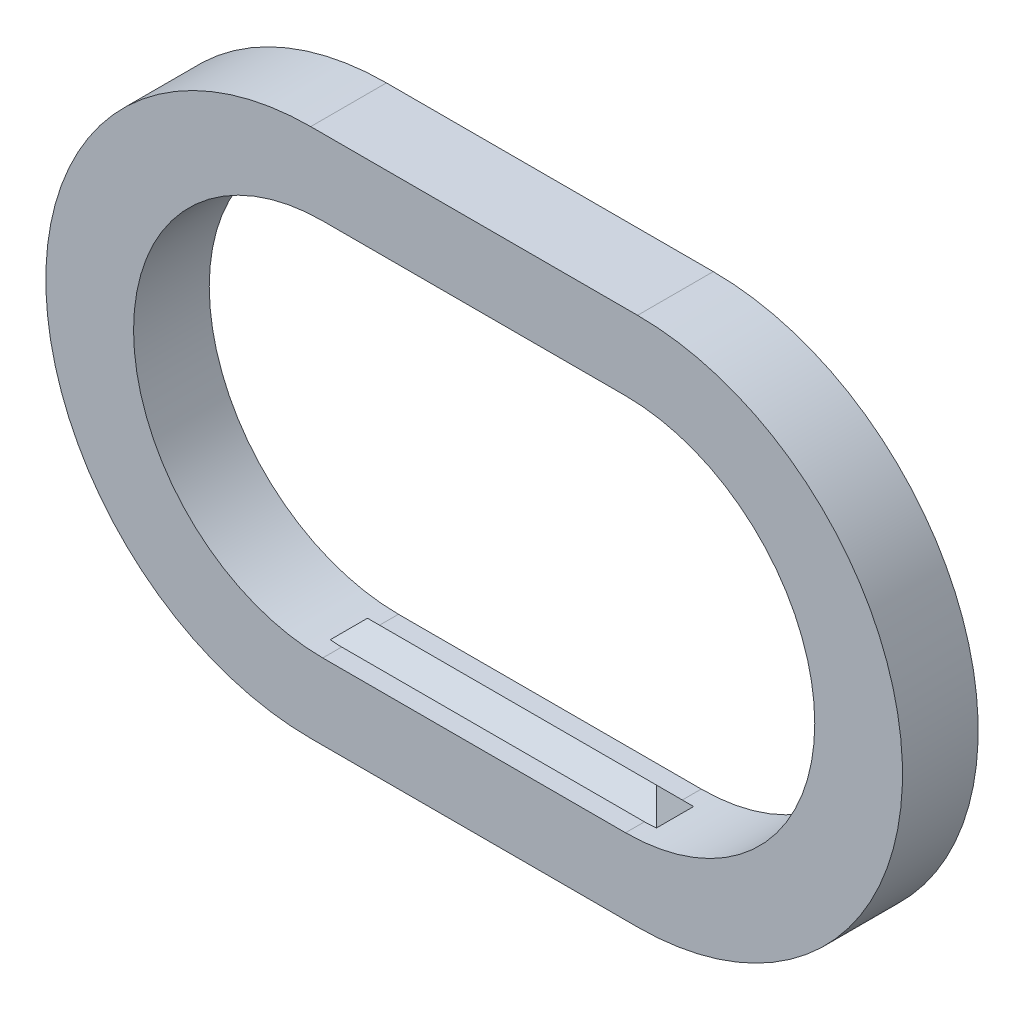
ISO-10303-21;
HEADER;
FILE_DESCRIPTION(('STEP AP214'),'2;1');
FILE_NAME('part.step','',(''),(''),'','','');
FILE_SCHEMA(('AUTOMOTIVE_DESIGN { 1 0 10303 214 1 1 1 1 }'));
ENDSEC;
DATA;
#1=APPLICATION_CONTEXT('core data for automotive mechanical design processes');
#2=APPLICATION_PROTOCOL_DEFINITION('international standard','automotive_design',2000,#1);
#3=PRODUCT_CONTEXT('',#1,'mechanical');
#4=PRODUCT('Part','Part','',(#3));
#5=PRODUCT_RELATED_PRODUCT_CATEGORY('part','',(#4));
#6=PRODUCT_DEFINITION_FORMATION('','',#4);
#7=PRODUCT_DEFINITION_CONTEXT('part definition',#1,'design');
#8=PRODUCT_DEFINITION('design','',#6,#7);
#9=PRODUCT_DEFINITION_SHAPE('','',#8);
#10=(LENGTH_UNIT() NAMED_UNIT(*) SI_UNIT(.MILLI.,.METRE.));
#11=(NAMED_UNIT(*) PLANE_ANGLE_UNIT() SI_UNIT($,.RADIAN.));
#12=(NAMED_UNIT(*) SI_UNIT($,.STERADIAN.) SOLID_ANGLE_UNIT());
#13=UNCERTAINTY_MEASURE_WITH_UNIT(LENGTH_MEASURE(1.E-05),#10,'distance_accuracy_value','');
#14=(GEOMETRIC_REPRESENTATION_CONTEXT(3) GLOBAL_UNCERTAINTY_ASSIGNED_CONTEXT((#13)) GLOBAL_UNIT_ASSIGNED_CONTEXT((#10,
#11,#12)) REPRESENTATION_CONTEXT('',''));
#15=CARTESIAN_POINT('',(0.,0.,0.));
#16=DIRECTION('',(0.,0.,1.));
#17=DIRECTION('',(1.,0.,0.));
#18=AXIS2_PLACEMENT_3D('',#15,#16,#17);
#19=CARTESIAN_POINT('',(20.2441875355783,3.91560724672013,2.));
#20=DIRECTION('',(0.,0.,-1.));
#21=DIRECTION('',(-1.,0.,0.));
#22=AXIS2_PLACEMENT_3D('',#19,#20,#21);
#23=CYLINDRICAL_SURFACE('',#22,5.);
#24=DIRECTION('',(0.,0.,-1.));
#25=VECTOR('',#24,1.);
#26=CARTESIAN_POINT('',(20.2441875355783,-1.08439275327987,2.));
#27=LINE('',#26,#25);
#28=CARTESIAN_POINT('',(20.2441875355783,-1.08439275327987,2.));
#29=VERTEX_POINT('',#28);
#30=CARTESIAN_POINT('',(20.2441875355783,-1.08439275327987,1.5));
#31=VERTEX_POINT('',#30);
#32=EDGE_CURVE('E186',#29,#31,#27,.T.);
#33=ORIENTED_EDGE('',*,*,#32,.T.);
#34=CARTESIAN_POINT('',(20.2441875355783,3.91560724672013,-3.5));
#35=DIRECTION('',(0.,0.707106781186547,0.707106781186547));
#36=DIRECTION('',(0.,0.707106781186548,-0.707106781186548));
#37=AXIS2_PLACEMENT_3D('',#34,#35,#36);
#38=ELLIPSE('',#37,7.07106781186548,5.);
#39=CARTESIAN_POINT('',(19.9352684242365,-1.07484052704204,1.49044777376217));
#40=VERTEX_POINT('',#39);
#41=EDGE_CURVE('E226',#31,#40,#38,.F.);
#42=ORIENTED_EDGE('',*,*,#41,.T.);
#43=DIRECTION('',(0.,0.,-1.));
#44=VECTOR('',#43,1.);
#45=CARTESIAN_POINT('',(19.9352684242365,-1.07484052704204,1.));
#46=LINE('',#45,#44);
#47=CARTESIAN_POINT('',(19.9352684242365,-1.07484052704204,0.509552226237828));
#48=VERTEX_POINT('',#47);
#49=EDGE_CURVE('E172',#40,#48,#46,.T.);
#50=ORIENTED_EDGE('',*,*,#49,.T.);
#51=CARTESIAN_POINT('',(20.2441875355783,3.91560724672013,5.49999999999996));
#52=DIRECTION('',(0.,0.707106781186545,-0.70710678118655));
#53=DIRECTION('',(0.,-0.70710678118655,-0.707106781186545));
#54=AXIS2_PLACEMENT_3D('',#51,#52,#53);
#55=ELLIPSE('',#54,7.07106781186545,5.);
#56=CARTESIAN_POINT('',(20.2441875355783,-1.08439275327987,0.5));
#57=VERTEX_POINT('',#56);
#58=EDGE_CURVE('E165',#48,#57,#55,.F.);
#59=ORIENTED_EDGE('',*,*,#58,.T.);
#60=CARTESIAN_POINT('',(20.2441875355783,-1.08439275327987,0.));
#61=VERTEX_POINT('',#60);
#62=EDGE_CURVE('E169',#57,#61,#27,.T.);
#63=ORIENTED_EDGE('',*,*,#62,.T.);
#64=CARTESIAN_POINT('',(20.2441875355783,3.91560724672013,0.));
#65=DIRECTION('',(0.,0.,1.));
#66=DIRECTION('',(1.,0.,0.));
#67=AXIS2_PLACEMENT_3D('',#64,#65,#66);
#68=CIRCLE('',#67,5.);
#69=CARTESIAN_POINT('',(20.2441875355783,8.91560724672013,0.));
#70=VERTEX_POINT('',#69);
#71=EDGE_CURVE('E234',#70,#61,#68,.T.);
#72=ORIENTED_EDGE('',*,*,#71,.F.);
#73=DIRECTION('',(0.,0.,-1.));
#74=VECTOR('',#73,1.);
#75=CARTESIAN_POINT('',(20.2441875355783,8.91560724672013,2.));
#76=LINE('',#75,#74);
#77=CARTESIAN_POINT('',(20.2441875355783,8.91560724672013,0.4));
#78=VERTEX_POINT('',#77);
#79=EDGE_CURVE('E269',#78,#70,#76,.T.);
#80=ORIENTED_EDGE('',*,*,#79,.F.);
#81=CARTESIAN_POINT('',(20.2441875355783,3.91560724672013,5.39999999999997));
#82=DIRECTION('',(0.,-0.707106781186545,-0.70710678118655));
#83=DIRECTION('',(0.,0.70710678118655,-0.707106781186545));
#84=AXIS2_PLACEMENT_3D('',#81,#82,#83);
#85=ELLIPSE('',#84,7.07106781186545,5.);
#86=CARTESIAN_POINT('',(19.9352684242365,8.9060550204823,0.40955222623783));
#87=VERTEX_POINT('',#86);
#88=EDGE_CURVE('E11',#78,#87,#85,.F.);
#89=ORIENTED_EDGE('',*,*,#88,.T.);
#90=DIRECTION('',(0.,0.,-1.));
#91=VECTOR('',#90,1.);
#92=CARTESIAN_POINT('',(19.9352684242365,8.9060550204823,0.9));
#93=LINE('',#92,#91);
#94=CARTESIAN_POINT('',(19.9352684242365,8.9060550204823,1.39044777376217));
#95=VERTEX_POINT('',#94);
#96=EDGE_CURVE('E196',#87,#95,#93,.F.);
#97=ORIENTED_EDGE('',*,*,#96,.T.);
#98=CARTESIAN_POINT('',(20.2441875355783,3.91560724672013,-3.59999999999997));
#99=DIRECTION('',(0.,-0.707106781186545,0.70710678118655));
#100=DIRECTION('',(0.,-0.70710678118655,-0.707106781186545));
#101=AXIS2_PLACEMENT_3D('',#98,#99,#100);
#102=ELLIPSE('',#101,7.07106781186545,5.);
#103=CARTESIAN_POINT('',(20.2441875355783,8.91560724672013,1.4));
#104=VERTEX_POINT('',#103);
#105=EDGE_CURVE('E228',#95,#104,#102,.F.);
#106=ORIENTED_EDGE('',*,*,#105,.T.);
#107=CARTESIAN_POINT('',(20.2441875355783,8.91560724672013,2.));
#108=VERTEX_POINT('',#107);
#109=EDGE_CURVE('E264',#108,#104,#76,.T.);
#110=ORIENTED_EDGE('',*,*,#109,.F.);
#111=CARTESIAN_POINT('',(20.2441875355783,3.91560724672013,2.));
#112=DIRECTION('',(0.,0.,1.));
#113=DIRECTION('',(1.,0.,0.));
#114=AXIS2_PLACEMENT_3D('',#111,#112,#113);
#115=CIRCLE('',#114,5.);
#116=EDGE_CURVE('E321',#108,#29,#115,.T.);
#117=ORIENTED_EDGE('',*,*,#116,.T.);
#118=EDGE_LOOP('',(#33,#42,#50,#59,#63,#72,#80,#89,#97,#106,#110,#117));
#119=FACE_BOUND('',#118,.T.);
#120=ADVANCED_FACE('F39',(#119),#23,.F.);
#121=CARTESIAN_POINT('',(28.2441875355783,3.91560724672013,2.));
#122=DIRECTION('',(0.,0.,-1.));
#123=DIRECTION('',(-1.,0.,0.));
#124=AXIS2_PLACEMENT_3D('',#121,#122,#123);
#125=CYLINDRICAL_SURFACE('',#124,5.);
#126=DIRECTION('',(0.,0.,-1.));
#127=VECTOR('',#126,1.);
#128=CARTESIAN_POINT('',(28.2441875355783,-1.08439275327987,2.));
#129=LINE('',#128,#127);
#130=CARTESIAN_POINT('',(28.2441875355783,-1.08439275327987,0.5));
#131=VERTEX_POINT('',#130);
#132=CARTESIAN_POINT('',(28.2441875355783,-1.08439275327987,0.));
#133=VERTEX_POINT('',#132);
#134=EDGE_CURVE('E267',#131,#133,#129,.T.);
#135=ORIENTED_EDGE('',*,*,#134,.F.);
#136=CARTESIAN_POINT('',(28.2441875355783,3.91560724672013,5.49999999999996));
#137=DIRECTION('',(0.,0.707106781186545,-0.70710678118655));
#138=DIRECTION('',(0.,-0.70710678118655,-0.707106781186545));
#139=AXIS2_PLACEMENT_3D('',#136,#137,#138);
#140=ELLIPSE('',#139,7.07106781186545,5.);
#141=CARTESIAN_POINT('',(28.5531066469201,-1.07484052704204,0.509552226237826));
#142=VERTEX_POINT('',#141);
#143=EDGE_CURVE('E176',#131,#142,#140,.F.);
#144=ORIENTED_EDGE('',*,*,#143,.T.);
#145=DIRECTION('',(0.,0.,-1.));
#146=VECTOR('',#145,1.);
#147=CARTESIAN_POINT('',(28.5531066469201,-1.07484052704204,1.));
#148=LINE('',#147,#146);
#149=CARTESIAN_POINT('',(28.5531066469201,-1.07484052704204,1.49044777376217));
#150=VERTEX_POINT('',#149);
#151=EDGE_CURVE('E206',#142,#150,#148,.F.);
#152=ORIENTED_EDGE('',*,*,#151,.T.);
#153=CARTESIAN_POINT('',(28.2441875355783,3.91560724672013,-3.5));
#154=DIRECTION('',(0.,0.707106781186547,0.707106781186547));
#155=DIRECTION('',(0.,0.707106781186548,-0.707106781186548));
#156=AXIS2_PLACEMENT_3D('',#153,#154,#155);
#157=ELLIPSE('',#156,7.07106781186548,5.);
#158=CARTESIAN_POINT('',(28.2441875355783,-1.08439275327987,1.5));
#159=VERTEX_POINT('',#158);
#160=EDGE_CURVE('E224',#150,#159,#157,.F.);
#161=ORIENTED_EDGE('',*,*,#160,.T.);
#162=CARTESIAN_POINT('',(28.2441875355783,-1.08439275327987,2.));
#163=VERTEX_POINT('',#162);
#164=EDGE_CURVE('E187',#163,#159,#129,.T.);
#165=ORIENTED_EDGE('',*,*,#164,.F.);
#166=CARTESIAN_POINT('',(28.2441875355783,3.91560724672013,2.));
#167=DIRECTION('',(0.,0.,1.));
#168=DIRECTION('',(1.,0.,0.));
#169=AXIS2_PLACEMENT_3D('',#166,#167,#168);
#170=CIRCLE('',#169,5.);
#171=CARTESIAN_POINT('',(28.2441875355783,8.91560724672013,2.));
#172=VERTEX_POINT('',#171);
#173=EDGE_CURVE('E312',#163,#172,#170,.T.);
#174=ORIENTED_EDGE('',*,*,#173,.T.);
#175=DIRECTION('',(0.,0.,-1.));
#176=VECTOR('',#175,1.);
#177=CARTESIAN_POINT('',(28.2441875355783,8.91560724672013,2.));
#178=LINE('',#177,#176);
#179=CARTESIAN_POINT('',(28.2441875355783,8.91560724672013,1.4));
#180=VERTEX_POINT('',#179);
#181=EDGE_CURVE('E263',#172,#180,#178,.T.);
#182=ORIENTED_EDGE('',*,*,#181,.T.);
#183=CARTESIAN_POINT('',(28.2441875355783,3.91560724672013,-3.59999999999997));
#184=DIRECTION('',(0.,-0.707106781186545,0.70710678118655));
#185=DIRECTION('',(0.,-0.70710678118655,-0.707106781186545));
#186=AXIS2_PLACEMENT_3D('',#183,#184,#185);
#187=ELLIPSE('',#186,7.07106781186545,5.);
#188=CARTESIAN_POINT('',(28.5531066469201,8.9060550204823,1.39044777376217));
#189=VERTEX_POINT('',#188);
#190=EDGE_CURVE('E177',#180,#189,#187,.F.);
#191=ORIENTED_EDGE('',*,*,#190,.T.);
#192=DIRECTION('',(0.,0.,-1.));
#193=VECTOR('',#192,1.);
#194=CARTESIAN_POINT('',(28.5531066469201,8.9060550204823,0.9));
#195=LINE('',#194,#193);
#196=CARTESIAN_POINT('',(28.5531066469201,8.9060550204823,0.40955222623783));
#197=VERTEX_POINT('',#196);
#198=EDGE_CURVE('E204',#189,#197,#195,.T.);
#199=ORIENTED_EDGE('',*,*,#198,.T.);
#200=CARTESIAN_POINT('',(28.2441875355783,3.91560724672013,5.39999999999997));
#201=DIRECTION('',(0.,-0.707106781186545,-0.70710678118655));
#202=DIRECTION('',(0.,0.70710678118655,-0.707106781186545));
#203=AXIS2_PLACEMENT_3D('',#200,#201,#202);
#204=ELLIPSE('',#203,7.07106781186545,5.);
#205=CARTESIAN_POINT('',(28.2441875355783,8.91560724672013,0.4));
#206=VERTEX_POINT('',#205);
#207=EDGE_CURVE('E49',#197,#206,#204,.F.);
#208=ORIENTED_EDGE('',*,*,#207,.T.);
#209=CARTESIAN_POINT('',(28.2441875355783,8.91560724672013,0.));
#210=VERTEX_POINT('',#209);
#211=EDGE_CURVE('E255',#206,#210,#178,.T.);
#212=ORIENTED_EDGE('',*,*,#211,.T.);
#213=CARTESIAN_POINT('',(28.2441875355783,3.91560724672013,0.));
#214=DIRECTION('',(0.,0.,1.));
#215=DIRECTION('',(1.,0.,0.));
#216=AXIS2_PLACEMENT_3D('',#213,#214,#215);
#217=CIRCLE('',#216,5.);
#218=EDGE_CURVE('E326',#133,#210,#217,.T.);
#219=ORIENTED_EDGE('',*,*,#218,.F.);
#220=EDGE_LOOP('',(#135,#144,#152,#161,#165,#174,#182,#191,#199,#208,#212,#219));
#221=FACE_BOUND('',#220,.T.);
#222=ADVANCED_FACE('F253',(#221),#125,.F.);
#223=CARTESIAN_POINT('',(20.2441875355783,-1.08439275327987,2.));
#224=DIRECTION('',(0.,1.,0.));
#225=DIRECTION('',(0.,0.,1.));
#226=AXIS2_PLACEMENT_3D('',#223,#224,#225);
#227=PLANE('',#226);
#228=ORIENTED_EDGE('',*,*,#164,.T.);
#229=DIRECTION('',(-1.,0.,0.));
#230=VECTOR('',#229,1.);
#231=CARTESIAN_POINT('',(20.2441875355783,-1.08439275327987,1.5));
#232=LINE('',#231,#230);
#233=EDGE_CURVE('E192',#159,#31,#232,.T.);
#234=ORIENTED_EDGE('',*,*,#233,.T.);
#235=ORIENTED_EDGE('',*,*,#32,.F.);
#236=DIRECTION('',(1.,0.,0.));
#237=VECTOR('',#236,1.);
#238=CARTESIAN_POINT('',(20.2441875355783,-1.08439275327987,2.));
#239=LINE('',#238,#237);
#240=EDGE_CURVE('E317',#29,#163,#239,.T.);
#241=ORIENTED_EDGE('',*,*,#240,.T.);
#242=EDGE_LOOP('',(#228,#234,#235,#241));
#243=FACE_BOUND('',#242,.T.);
#244=ADVANCED_FACE('F331',(#243),#227,.T.);
#245=ORIENTED_EDGE('',*,*,#62,.F.);
#246=DIRECTION('',(1.,0.,0.));
#247=VECTOR('',#246,1.);
#248=CARTESIAN_POINT('',(20.2441875355783,-1.08439275327987,0.5));
#249=LINE('',#248,#247);
#250=EDGE_CURVE('E181',#57,#131,#249,.T.);
#251=ORIENTED_EDGE('',*,*,#250,.T.);
#252=ORIENTED_EDGE('',*,*,#134,.T.);
#253=DIRECTION('',(1.,0.,0.));
#254=VECTOR('',#253,1.);
#255=CARTESIAN_POINT('',(20.2441875355783,-1.08439275327987,0.));
#256=LINE('',#255,#254);
#257=EDGE_CURVE('E184',#61,#133,#256,.T.);
#258=ORIENTED_EDGE('',*,*,#257,.F.);
#259=EDGE_LOOP('',(#245,#251,#252,#258));
#260=FACE_BOUND('',#259,.T.);
#261=ADVANCED_FACE('F180',(#260),#227,.T.);
#262=CARTESIAN_POINT('',(20.2441875355783,8.91560724672013,2.));
#263=DIRECTION('',(0.,-1.,0.));
#264=DIRECTION('',(0.,0.,-1.));
#265=AXIS2_PLACEMENT_3D('',#262,#263,#264);
#266=PLANE('',#265);
#267=ORIENTED_EDGE('',*,*,#211,.F.);
#268=DIRECTION('',(-1.,0.,0.));
#269=VECTOR('',#268,1.);
#270=CARTESIAN_POINT('',(20.2441875355783,8.91560724672013,0.4));
#271=LINE('',#270,#269);
#272=EDGE_CURVE('E193',#206,#78,#271,.T.);
#273=ORIENTED_EDGE('',*,*,#272,.T.);
#274=ORIENTED_EDGE('',*,*,#79,.T.);
#275=DIRECTION('',(-1.,0.,0.));
#276=VECTOR('',#275,1.);
#277=CARTESIAN_POINT('',(20.2441875355783,8.91560724672013,0.));
#278=LINE('',#277,#276);
#279=EDGE_CURVE('E261',#210,#70,#278,.T.);
#280=ORIENTED_EDGE('',*,*,#279,.F.);
#281=EDGE_LOOP('',(#267,#273,#274,#280));
#282=FACE_BOUND('',#281,.T.);
#283=ADVANCED_FACE('F258',(#282),#266,.T.);
#284=ORIENTED_EDGE('',*,*,#109,.T.);
#285=DIRECTION('',(1.,0.,0.));
#286=VECTOR('',#285,1.);
#287=CARTESIAN_POINT('',(20.2441875355783,8.91560724672013,1.4));
#288=LINE('',#287,#286);
#289=EDGE_CURVE('E198',#104,#180,#288,.T.);
#290=ORIENTED_EDGE('',*,*,#289,.T.);
#291=ORIENTED_EDGE('',*,*,#181,.F.);
#292=DIRECTION('',(-1.,0.,0.));
#293=VECTOR('',#292,1.);
#294=CARTESIAN_POINT('',(20.2441875355783,8.91560724672013,2.));
#295=LINE('',#294,#293);
#296=EDGE_CURVE('E316',#172,#108,#295,.T.);
#297=ORIENTED_EDGE('',*,*,#296,.T.);
#298=EDGE_LOOP('',(#284,#290,#291,#297));
#299=FACE_BOUND('',#298,.T.);
#300=ADVANCED_FACE('F307',(#299),#266,.T.);
#301=CARTESIAN_POINT('',(19.9257161979987,3.91560724672013,2.));
#302=DIRECTION('',(0.,0.,1.));
#303=DIRECTION('',(1.,0.,0.));
#304=AXIS2_PLACEMENT_3D('',#301,#302,#303);
#305=PLANE('',#304);
#306=CARTESIAN_POINT('',(19.9257161979987,3.91560724672013,2.));
#307=DIRECTION('',(0.,0.,1.));
#308=DIRECTION('',(1.,0.,0.));
#309=AXIS2_PLACEMENT_3D('',#306,#307,#308);
#310=CIRCLE('',#309,7.);
#311=CARTESIAN_POINT('',(19.9257161979987,10.9156072467201,2.));
#312=VERTEX_POINT('',#311);
#313=CARTESIAN_POINT('',(19.9257161979987,-3.08439275327987,2.));
#314=VERTEX_POINT('',#313);
#315=EDGE_CURVE('E276',#312,#314,#310,.T.);
#316=ORIENTED_EDGE('',*,*,#315,.T.);
#317=DIRECTION('',(1.,0.,0.));
#318=VECTOR('',#317,1.);
#319=CARTESIAN_POINT('',(19.9257161979987,-3.08439275327987,2.));
#320=LINE('',#319,#318);
#321=CARTESIAN_POINT('',(28.5626588731579,-3.08439275327987,2.));
#322=VERTEX_POINT('',#321);
#323=EDGE_CURVE('E279',#314,#322,#320,.T.);
#324=ORIENTED_EDGE('',*,*,#323,.T.);
#325=CARTESIAN_POINT('',(28.5626588731579,3.91560724672012,2.));
#326=DIRECTION('',(0.,0.,1.));
#327=DIRECTION('',(1.,0.,0.));
#328=AXIS2_PLACEMENT_3D('',#325,#326,#327);
#329=CIRCLE('',#328,7.);
#330=CARTESIAN_POINT('',(28.5626588731579,10.9156072467201,2.));
#331=VERTEX_POINT('',#330);
#332=EDGE_CURVE('E282',#322,#331,#329,.T.);
#333=ORIENTED_EDGE('',*,*,#332,.T.);
#334=DIRECTION('',(-1.,0.,0.));
#335=VECTOR('',#334,1.);
#336=CARTESIAN_POINT('',(19.9257161979987,10.9156072467201,2.));
#337=LINE('',#336,#335);
#338=EDGE_CURVE('E284',#331,#312,#337,.T.);
#339=ORIENTED_EDGE('',*,*,#338,.T.);
#340=EDGE_LOOP('',(#316,#324,#333,#339));
#341=FACE_BOUND('',#340,.T.);
#342=ORIENTED_EDGE('',*,*,#240,.F.);
#343=ORIENTED_EDGE('',*,*,#116,.F.);
#344=ORIENTED_EDGE('',*,*,#296,.F.);
#345=ORIENTED_EDGE('',*,*,#173,.F.);
#346=EDGE_LOOP('',(#342,#343,#344,#345));
#347=FACE_BOUND('',#346,.T.);
#348=ADVANCED_FACE('F320',(#341,#347),#305,.T.);
#349=CARTESIAN_POINT('',(19.9257161979987,3.91560724672013,0.));
#350=DIRECTION('',(0.,0.,1.));
#351=DIRECTION('',(1.,0.,0.));
#352=AXIS2_PLACEMENT_3D('',#349,#350,#351);
#353=PLANE('',#352);
#354=CARTESIAN_POINT('',(19.9257161979987,3.91560724672013,0.));
#355=DIRECTION('',(0.,0.,1.));
#356=DIRECTION('',(1.,0.,0.));
#357=AXIS2_PLACEMENT_3D('',#354,#355,#356);
#358=CIRCLE('',#357,7.);
#359=CARTESIAN_POINT('',(19.9257161979987,10.9156072467201,0.));
#360=VERTEX_POINT('',#359);
#361=CARTESIAN_POINT('',(19.9257161979987,-3.08439275327987,0.));
#362=VERTEX_POINT('',#361);
#363=EDGE_CURVE('E275',#360,#362,#358,.T.);
#364=ORIENTED_EDGE('',*,*,#363,.F.);
#365=DIRECTION('',(-1.,0.,0.));
#366=VECTOR('',#365,1.);
#367=CARTESIAN_POINT('',(19.9257161979987,10.9156072467201,0.));
#368=LINE('',#367,#366);
#369=CARTESIAN_POINT('',(28.5626588731579,10.9156072467201,0.));
#370=VERTEX_POINT('',#369);
#371=EDGE_CURVE('E280',#370,#360,#368,.T.);
#372=ORIENTED_EDGE('',*,*,#371,.F.);
#373=CARTESIAN_POINT('',(28.5626588731579,3.91560724672012,0.));
#374=DIRECTION('',(0.,0.,1.));
#375=DIRECTION('',(1.,0.,0.));
#376=AXIS2_PLACEMENT_3D('',#373,#374,#375);
#377=CIRCLE('',#376,7.);
#378=CARTESIAN_POINT('',(28.5626588731579,-3.08439275327987,0.));
#379=VERTEX_POINT('',#378);
#380=EDGE_CURVE('E291',#379,#370,#377,.T.);
#381=ORIENTED_EDGE('',*,*,#380,.F.);
#382=DIRECTION('',(1.,0.,0.));
#383=VECTOR('',#382,1.);
#384=CARTESIAN_POINT('',(19.9257161979987,-3.08439275327987,0.));
#385=LINE('',#384,#383);
#386=EDGE_CURVE('E289',#362,#379,#385,.T.);
#387=ORIENTED_EDGE('',*,*,#386,.F.);
#388=EDGE_LOOP('',(#364,#372,#381,#387));
#389=FACE_BOUND('',#388,.T.);
#390=ORIENTED_EDGE('',*,*,#71,.T.);
#391=ORIENTED_EDGE('',*,*,#257,.T.);
#392=ORIENTED_EDGE('',*,*,#218,.T.);
#393=ORIENTED_EDGE('',*,*,#279,.T.);
#394=EDGE_LOOP('',(#390,#391,#392,#393));
#395=FACE_BOUND('',#394,.T.);
#396=ADVANCED_FACE('F355',(#389,#395),#353,.F.);
#397=CARTESIAN_POINT('',(19.9257161979987,3.91560724672013,2.));
#398=DIRECTION('',(0.,0.,-1.));
#399=DIRECTION('',(-1.,0.,0.));
#400=AXIS2_PLACEMENT_3D('',#397,#398,#399);
#401=CYLINDRICAL_SURFACE('',#400,7.);
#402=ORIENTED_EDGE('',*,*,#363,.T.);
#403=DIRECTION('',(0.,0.,-1.));
#404=VECTOR('',#403,1.);
#405=CARTESIAN_POINT('',(19.9257161979987,-3.08439275327987,2.));
#406=LINE('',#405,#404);
#407=EDGE_CURVE('E302',#314,#362,#406,.T.);
#408=ORIENTED_EDGE('',*,*,#407,.F.);
#409=ORIENTED_EDGE('',*,*,#315,.F.);
#410=DIRECTION('',(0.,0.,-1.));
#411=VECTOR('',#410,1.);
#412=CARTESIAN_POINT('',(19.9257161979987,10.9156072467201,2.));
#413=LINE('',#412,#411);
#414=EDGE_CURVE('E286',#312,#360,#413,.T.);
#415=ORIENTED_EDGE('',*,*,#414,.T.);
#416=EDGE_LOOP('',(#402,#408,#409,#415));
#417=FACE_BOUND('',#416,.T.);
#418=ADVANCED_FACE('F359',(#417),#401,.T.);
#419=CARTESIAN_POINT('',(19.9257161979987,-3.08439275327987,2.));
#420=DIRECTION('',(0.,1.,0.));
#421=DIRECTION('',(-1.,0.,0.));
#422=AXIS2_PLACEMENT_3D('',#419,#420,#421);
#423=PLANE('',#422);
#424=ORIENTED_EDGE('',*,*,#386,.T.);
#425=DIRECTION('',(0.,0.,-1.));
#426=VECTOR('',#425,1.);
#427=CARTESIAN_POINT('',(28.5626588731579,-3.08439275327987,2.));
#428=LINE('',#427,#426);
#429=EDGE_CURVE('E299',#322,#379,#428,.T.);
#430=ORIENTED_EDGE('',*,*,#429,.F.);
#431=ORIENTED_EDGE('',*,*,#323,.F.);
#432=ORIENTED_EDGE('',*,*,#407,.T.);
#433=EDGE_LOOP('',(#424,#430,#431,#432));
#434=FACE_BOUND('',#433,.T.);
#435=ADVANCED_FACE('F369',(#434),#423,.F.);
#436=CARTESIAN_POINT('',(28.5626588731579,3.91560724672012,2.));
#437=DIRECTION('',(0.,0.,-1.));
#438=DIRECTION('',(-1.,0.,0.));
#439=AXIS2_PLACEMENT_3D('',#436,#437,#438);
#440=CYLINDRICAL_SURFACE('',#439,7.);
#441=ORIENTED_EDGE('',*,*,#380,.T.);
#442=DIRECTION('',(0.,0.,-1.));
#443=VECTOR('',#442,1.);
#444=CARTESIAN_POINT('',(28.5626588731579,10.9156072467201,2.));
#445=LINE('',#444,#443);
#446=EDGE_CURVE('E296',#331,#370,#445,.T.);
#447=ORIENTED_EDGE('',*,*,#446,.F.);
#448=ORIENTED_EDGE('',*,*,#332,.F.);
#449=ORIENTED_EDGE('',*,*,#429,.T.);
#450=EDGE_LOOP('',(#441,#447,#448,#449));
#451=FACE_BOUND('',#450,.T.);
#452=ADVANCED_FACE('F365',(#451),#440,.T.);
#453=CARTESIAN_POINT('',(19.9257161979987,10.9156072467201,2.));
#454=DIRECTION('',(0.,-1.,0.));
#455=DIRECTION('',(0.,0.,-1.));
#456=AXIS2_PLACEMENT_3D('',#453,#454,#455);
#457=PLANE('',#456);
#458=ORIENTED_EDGE('',*,*,#371,.T.);
#459=ORIENTED_EDGE('',*,*,#414,.F.);
#460=ORIENTED_EDGE('',*,*,#338,.F.);
#461=ORIENTED_EDGE('',*,*,#446,.T.);
#462=EDGE_LOOP('',(#458,#459,#460,#461));
#463=FACE_BOUND('',#462,.T.);
#464=ADVANCED_FACE('F361',(#463),#457,.F.);
#465=CARTESIAN_POINT('',(20.4257161979987,8.41560724672012,0.));
#466=DIRECTION('',(-0.707106781186545,-0.70710678118655,0.));
#467=DIRECTION('',(0.,0.,1.));
#468=AXIS2_PLACEMENT_3D('',#465,#466,#467);
#469=PLANE('',#468);
#470=DIRECTION('',(0.57735026918963,-0.577350269189626,0.577350269189622));
#471=VECTOR('',#470,1.);
#472=CARTESIAN_POINT('',(20.1257161979987,8.71560724672012,0.600000000000002));
#473=LINE('',#472,#471);
#474=CARTESIAN_POINT('',(20.4257161979987,8.41560724672012,0.899999999999997));
#475=VERTEX_POINT('',#474);
#476=EDGE_CURVE('E218',#87,#475,#473,.T.);
#477=ORIENTED_EDGE('',*,*,#476,.T.);
#478=DIRECTION('',(-0.57735026918963,0.577350269189626,0.577350269189622));
#479=VECTOR('',#478,1.);
#480=CARTESIAN_POINT('',(20.7257161979987,8.11560724672013,0.600000000000006));
#481=LINE('',#480,#479);
#482=EDGE_CURVE('E220',#475,#95,#481,.T.);
#483=ORIENTED_EDGE('',*,*,#482,.T.);
#484=ORIENTED_EDGE('',*,*,#96,.F.);
#485=EDGE_LOOP('',(#477,#483,#484));
#486=FACE_BOUND('',#485,.T.);
#487=ADVANCED_FACE('F364',(#486),#469,.T.);
#488=CARTESIAN_POINT('',(28.0626588731579,8.41560724672012,0.));
#489=DIRECTION('',(0.707106781186545,-0.70710678118655,0.));
#490=DIRECTION('',(0.,0.,-1.));
#491=AXIS2_PLACEMENT_3D('',#488,#489,#490);
#492=PLANE('',#491);
#493=ORIENTED_EDGE('',*,*,#198,.F.);
#494=DIRECTION('',(-0.57735026918963,-0.577350269189626,-0.577350269189622));
#495=VECTOR('',#494,1.);
#496=CARTESIAN_POINT('',(27.7626588731579,8.11560724672013,0.600000000000006));
#497=LINE('',#496,#495);
#498=CARTESIAN_POINT('',(28.0626588731579,8.41560724672012,0.899999999999997));
#499=VERTEX_POINT('',#498);
#500=EDGE_CURVE('E57',#189,#499,#497,.T.);
#501=ORIENTED_EDGE('',*,*,#500,.T.);
#502=DIRECTION('',(0.57735026918963,0.577350269189626,-0.577350269189622));
#503=VECTOR('',#502,1.);
#504=CARTESIAN_POINT('',(28.3626588731579,8.71560724672012,0.600000000000002));
#505=LINE('',#504,#503);
#506=EDGE_CURVE('E60',#499,#197,#505,.T.);
#507=ORIENTED_EDGE('',*,*,#506,.T.);
#508=EDGE_LOOP('',(#493,#501,#507));
#509=FACE_BOUND('',#508,.T.);
#510=ADVANCED_FACE('F383',(#509),#492,.T.);
#511=CARTESIAN_POINT('',(28.0626588731579,-0.58439275327987,0.));
#512=DIRECTION('',(0.707106781186545,0.70710678118655,0.));
#513=DIRECTION('',(0.,0.,1.));
#514=AXIS2_PLACEMENT_3D('',#511,#512,#513);
#515=PLANE('',#514);
#516=DIRECTION('',(-0.57735026918963,0.577350269189626,0.577350269189622));
#517=VECTOR('',#516,1.);
#518=CARTESIAN_POINT('',(28.3959922064912,-0.9177260866132,0.666666666666669));
#519=LINE('',#518,#517);
#520=CARTESIAN_POINT('',(28.0626588731579,-0.58439275327987,0.999999999999997));
#521=VERTEX_POINT('',#520);
#522=EDGE_CURVE('E210',#142,#521,#519,.T.);
#523=ORIENTED_EDGE('',*,*,#522,.T.);
#524=DIRECTION('',(0.577350269189628,-0.577350269189624,0.577350269189625));
#525=VECTOR('',#524,1.);
#526=CARTESIAN_POINT('',(27.7293255398246,-0.251059419946539,0.666666666666668));
#527=LINE('',#526,#525);
#528=EDGE_CURVE('E212',#521,#150,#527,.T.);
#529=ORIENTED_EDGE('',*,*,#528,.T.);
#530=ORIENTED_EDGE('',*,*,#151,.F.);
#531=EDGE_LOOP('',(#523,#529,#530));
#532=FACE_BOUND('',#531,.T.);
#533=ADVANCED_FACE('F390',(#532),#515,.T.);
#534=CARTESIAN_POINT('',(20.4257161979987,-0.584392753279871,0.));
#535=DIRECTION('',(-0.707106781186545,0.70710678118655,0.));
#536=DIRECTION('',(0.,0.,-1.));
#537=AXIS2_PLACEMENT_3D('',#534,#535,#536);
#538=PLANE('',#537);
#539=ORIENTED_EDGE('',*,*,#49,.F.);
#540=DIRECTION('',(0.577350269189629,0.577350269189624,-0.577350269189624));
#541=VECTOR('',#540,1.);
#542=CARTESIAN_POINT('',(20.759049531332,-0.25105941994654,0.666666666666668));
#543=LINE('',#542,#541);
#544=CARTESIAN_POINT('',(20.4257161979987,-0.584392753279871,0.999999999999997));
#545=VERTEX_POINT('',#544);
#546=EDGE_CURVE('E216',#40,#545,#543,.T.);
#547=ORIENTED_EDGE('',*,*,#546,.T.);
#548=DIRECTION('',(-0.57735026918963,-0.577350269189626,-0.577350269189622));
#549=VECTOR('',#548,1.);
#550=CARTESIAN_POINT('',(20.0923828646653,-0.917726086613201,0.666666666666669));
#551=LINE('',#550,#549);
#552=EDGE_CURVE('E214',#545,#48,#551,.T.);
#553=ORIENTED_EDGE('',*,*,#552,.T.);
#554=EDGE_LOOP('',(#539,#547,#553));
#555=FACE_BOUND('',#554,.T.);
#556=ADVANCED_FACE('F334',(#555),#538,.T.);
#557=CARTESIAN_POINT('',(0.,-0.584392753279874,0.999999999999997));
#558=DIRECTION('',(0.,0.707106781186545,-0.70710678118655));
#559=DIRECTION('',(1.,0.,0.));
#560=AXIS2_PLACEMENT_3D('',#557,#558,#559);
#561=PLANE('',#560);
#562=ORIENTED_EDGE('',*,*,#58,.F.);
#563=ORIENTED_EDGE('',*,*,#552,.F.);
#564=DIRECTION('',(-1.,0.,0.));
#565=VECTOR('',#564,1.);
#566=CARTESIAN_POINT('',(20.4257161979987,-0.584392753279871,0.999999999999997));
#567=LINE('',#566,#565);
#568=EDGE_CURVE('E232',#521,#545,#567,.T.);
#569=ORIENTED_EDGE('',*,*,#568,.F.);
#570=ORIENTED_EDGE('',*,*,#522,.F.);
#571=ORIENTED_EDGE('',*,*,#143,.F.);
#572=ORIENTED_EDGE('',*,*,#250,.F.);
#573=EDGE_LOOP('',(#562,#563,#569,#570,#571,#572));
#574=FACE_BOUND('',#573,.T.);
#575=ADVANCED_FACE('F190',(#574),#561,.T.);
#576=CARTESIAN_POINT('',(0.,-0.584392753279874,1.));
#577=DIRECTION('',(0.,0.707106781186547,0.707106781186547));
#578=DIRECTION('',(-1.,0.,0.));
#579=AXIS2_PLACEMENT_3D('',#576,#577,#578);
#580=PLANE('',#579);
#581=ORIENTED_EDGE('',*,*,#41,.F.);
#582=ORIENTED_EDGE('',*,*,#233,.F.);
#583=ORIENTED_EDGE('',*,*,#160,.F.);
#584=ORIENTED_EDGE('',*,*,#528,.F.);
#585=ORIENTED_EDGE('',*,*,#568,.T.);
#586=ORIENTED_EDGE('',*,*,#546,.F.);
#587=EDGE_LOOP('',(#581,#582,#583,#584,#585,#586));
#588=FACE_BOUND('',#587,.T.);
#589=ADVANCED_FACE('F335',(#588),#580,.T.);
#590=CARTESIAN_POINT('',(0.,8.41560724672012,0.899999999999997));
#591=DIRECTION('',(0.,-0.707106781186545,-0.70710678118655));
#592=DIRECTION('',(-1.,0.,0.));
#593=AXIS2_PLACEMENT_3D('',#590,#591,#592);
#594=PLANE('',#593);
#595=ORIENTED_EDGE('',*,*,#207,.F.);
#596=ORIENTED_EDGE('',*,*,#506,.F.);
#597=DIRECTION('',(1.,0.,0.));
#598=VECTOR('',#597,1.);
#599=CARTESIAN_POINT('',(28.0626588731579,8.41560724672012,0.899999999999997));
#600=LINE('',#599,#598);
#601=EDGE_CURVE('E44',#475,#499,#600,.T.);
#602=ORIENTED_EDGE('',*,*,#601,.F.);
#603=ORIENTED_EDGE('',*,*,#476,.F.);
#604=ORIENTED_EDGE('',*,*,#88,.F.);
#605=ORIENTED_EDGE('',*,*,#272,.F.);
#606=EDGE_LOOP('',(#595,#596,#602,#603,#604,#605));
#607=FACE_BOUND('',#606,.T.);
#608=ADVANCED_FACE('F42',(#607),#594,.T.);
#609=CARTESIAN_POINT('',(0.,8.41560724672012,0.900000000000003));
#610=DIRECTION('',(0.,-0.707106781186545,0.70710678118655));
#611=DIRECTION('',(1.,0.,0.));
#612=AXIS2_PLACEMENT_3D('',#609,#610,#611);
#613=PLANE('',#612);
#614=ORIENTED_EDGE('',*,*,#190,.F.);
#615=ORIENTED_EDGE('',*,*,#289,.F.);
#616=ORIENTED_EDGE('',*,*,#105,.F.);
#617=ORIENTED_EDGE('',*,*,#482,.F.);
#618=ORIENTED_EDGE('',*,*,#601,.T.);
#619=ORIENTED_EDGE('',*,*,#500,.F.);
#620=EDGE_LOOP('',(#614,#615,#616,#617,#618,#619));
#621=FACE_BOUND('',#620,.T.);
#622=ADVANCED_FACE('F244',(#621),#613,.T.);
#623=CLOSED_SHELL('',(#120,#222,#244,#261,#283,#300,#348,#396,#418,#435,#452,#464,#487,#510,
#533,#556,#575,#589,#608,#622));
#624=MANIFOLD_SOLID_BREP('B2',#623);
#625=ADVANCED_BREP_SHAPE_REPRESENTATION('',(#18,#624),#14);
#626=SHAPE_DEFINITION_REPRESENTATION(#9,#625);
ENDSEC;
END-ISO-10303-21;
